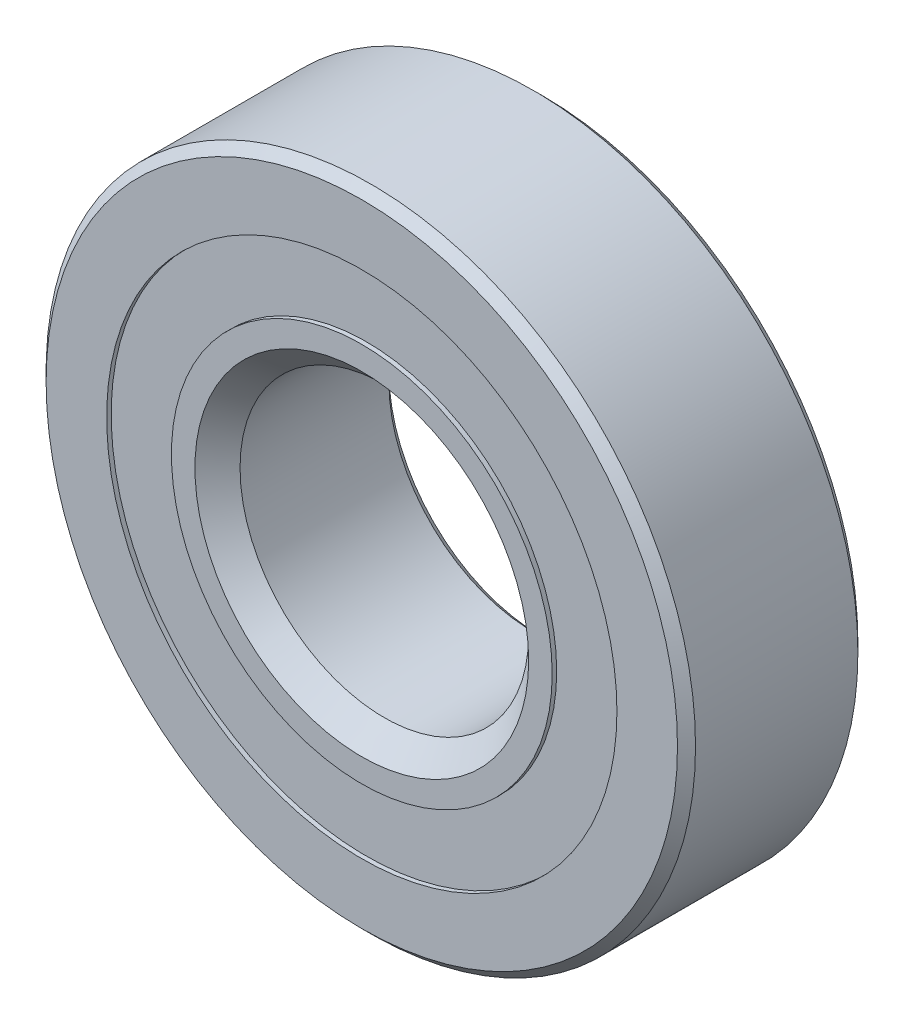
ISO-10303-21;
HEADER;
FILE_DESCRIPTION(('STEP AP214'),'2;1');
FILE_NAME('part.step','',(''),(''),'','','');
FILE_SCHEMA(('AUTOMOTIVE_DESIGN { 1 0 10303 214 1 1 1 1 }'));
ENDSEC;
DATA;
#1=APPLICATION_CONTEXT('core data for automotive mechanical design processes');
#2=APPLICATION_PROTOCOL_DEFINITION('international standard','automotive_design',2000,#1);
#3=PRODUCT_CONTEXT('',#1,'mechanical');
#4=PRODUCT('Part','Part','',(#3));
#5=PRODUCT_RELATED_PRODUCT_CATEGORY('part','',(#4));
#6=PRODUCT_DEFINITION_FORMATION('','',#4);
#7=PRODUCT_DEFINITION_CONTEXT('part definition',#1,'design');
#8=PRODUCT_DEFINITION('design','',#6,#7);
#9=PRODUCT_DEFINITION_SHAPE('','',#8);
#10=(LENGTH_UNIT() NAMED_UNIT(*) SI_UNIT(.MILLI.,.METRE.));
#11=(NAMED_UNIT(*) PLANE_ANGLE_UNIT() SI_UNIT($,.RADIAN.));
#12=(NAMED_UNIT(*) SI_UNIT($,.STERADIAN.) SOLID_ANGLE_UNIT());
#13=UNCERTAINTY_MEASURE_WITH_UNIT(LENGTH_MEASURE(1.E-05),#10,'distance_accuracy_value','');
#14=(GEOMETRIC_REPRESENTATION_CONTEXT(3) GLOBAL_UNCERTAINTY_ASSIGNED_CONTEXT((#13)) GLOBAL_UNIT_ASSIGNED_CONTEXT((#10,
#11,#12)) REPRESENTATION_CONTEXT('',''));
#15=CARTESIAN_POINT('',(0.,0.,0.));
#16=DIRECTION('',(0.,0.,1.));
#17=DIRECTION('',(1.,0.,0.));
#18=AXIS2_PLACEMENT_3D('',#15,#16,#17);
#19=CARTESIAN_POINT('',(0.,11.2258928571429,-3.77031250000001));
#20=DIRECTION('',(0.,0.,1.));
#21=DIRECTION('',(1.,0.,0.));
#22=AXIS2_PLACEMENT_3D('',#19,#20,#21);
#23=PLANE('',#22);
#24=CARTESIAN_POINT('',(0.,0.,-3.77031250000001));
#25=DIRECTION('',(0.,0.,1.));
#26=DIRECTION('',(1.,0.,0.));
#27=AXIS2_PLACEMENT_3D('',#24,#25,#26);
#28=CIRCLE('',#27,11.2258928571429);
#29=CARTESIAN_POINT('',(11.2258928571429,0.,-3.77031250000001));
#30=VERTEX_POINT('',#29);
#31=EDGE_CURVE('E57',#30,#30,#28,.T.);
#32=ORIENTED_EDGE('',*,*,#31,.F.);
#33=EDGE_LOOP('',(#32));
#34=FACE_BOUND('',#33,.T.);
#35=CARTESIAN_POINT('',(0.,0.,-3.77031250000001));
#36=DIRECTION('',(0.,0.,1.));
#37=DIRECTION('',(1.,0.,0.));
#38=AXIS2_PLACEMENT_3D('',#35,#36,#37);
#39=CIRCLE('',#38,8.37711985732587);
#40=CARTESIAN_POINT('',(8.37711985732587,0.,-3.77031250000001));
#41=VERTEX_POINT('',#40);
#42=EDGE_CURVE('E11',#41,#41,#39,.T.);
#43=ORIENTED_EDGE('',*,*,#42,.T.);
#44=EDGE_LOOP('',(#43));
#45=FACE_BOUND('',#44,.T.);
#46=ADVANCED_FACE('F43',(#34,#45),#23,.F.);
#47=CARTESIAN_POINT('',(0.,0.,3.96875));
#48=DIRECTION('',(0.,0.,1.));
#49=DIRECTION('',(1.,0.,0.));
#50=AXIS2_PLACEMENT_3D('',#47,#48,#49);
#51=CYLINDRICAL_SURFACE('',#50,8.37711985732587);
#52=ORIENTED_EDGE('',*,*,#42,.F.);
#53=EDGE_LOOP('',(#52));
#54=FACE_BOUND('',#53,.T.);
#55=CARTESIAN_POINT('',(0.,0.,-1.98348485641081));
#56=DIRECTION('',(0.,0.,1.));
#57=DIRECTION('',(1.,0.,0.));
#58=AXIS2_PLACEMENT_3D('',#55,#56,#57);
#59=CIRCLE('',#58,8.37711985732587);
#60=CARTESIAN_POINT('',(8.37711985732587,0.,-1.98348485641081));
#61=VERTEX_POINT('',#60);
#62=EDGE_CURVE('E49',#61,#61,#59,.T.);
#63=ORIENTED_EDGE('',*,*,#62,.T.);
#64=EDGE_LOOP('',(#63));
#65=FACE_BOUND('',#64,.T.);
#66=ADVANCED_FACE('F66',(#54,#65),#51,.F.);
#67=CARTESIAN_POINT('',(0.,11.2258928571429,-1.98348485641081));
#68=DIRECTION('',(0.,0.,-1.));
#69=DIRECTION('',(-1.,0.,0.));
#70=AXIS2_PLACEMENT_3D('',#67,#68,#69);
#71=PLANE('',#70);
#72=ORIENTED_EDGE('',*,*,#62,.F.);
#73=EDGE_LOOP('',(#72));
#74=FACE_BOUND('',#73,.T.);
#75=CARTESIAN_POINT('',(0.,0.,-1.98348485641081));
#76=DIRECTION('',(0.,0.,1.));
#77=DIRECTION('',(1.,0.,0.));
#78=AXIS2_PLACEMENT_3D('',#75,#76,#77);
#79=CIRCLE('',#78,11.2258928571429);
#80=CARTESIAN_POINT('',(11.2258928571429,0.,-1.98348485641081));
#81=VERTEX_POINT('',#80);
#82=EDGE_CURVE('E53',#81,#81,#79,.T.);
#83=ORIENTED_EDGE('',*,*,#82,.T.);
#84=EDGE_LOOP('',(#83));
#85=FACE_BOUND('',#84,.T.);
#86=ADVANCED_FACE('F70',(#74,#85),#71,.F.);
#87=CARTESIAN_POINT('',(0.,0.,3.96875));
#88=DIRECTION('',(0.,0.,1.));
#89=DIRECTION('',(1.,0.,0.));
#90=AXIS2_PLACEMENT_3D('',#87,#88,#89);
#91=CYLINDRICAL_SURFACE('',#90,11.2258928571429);
#92=ORIENTED_EDGE('',*,*,#82,.F.);
#93=EDGE_LOOP('',(#92));
#94=FACE_BOUND('',#93,.T.);
#95=ORIENTED_EDGE('',*,*,#31,.T.);
#96=EDGE_LOOP('',(#95));
#97=FACE_BOUND('',#96,.T.);
#98=ADVANCED_FACE('F63',(#94,#97),#91,.T.);
#99=CLOSED_SHELL('',(#46,#66,#86,#98));
#100=MANIFOLD_SOLID_BREP('B2',#99);
#101=CARTESIAN_POINT('',(0.,11.2258928571429,3.7703125));
#102=DIRECTION('',(0.,0.,-1.));
#103=DIRECTION('',(-1.,0.,0.));
#104=AXIS2_PLACEMENT_3D('',#101,#102,#103);
#105=PLANE('',#104);
#106=CARTESIAN_POINT('',(0.,0.,3.7703125));
#107=DIRECTION('',(0.,0.,1.));
#108=DIRECTION('',(1.,0.,0.));
#109=AXIS2_PLACEMENT_3D('',#106,#107,#108);
#110=CIRCLE('',#109,8.37711985732587);
#111=CARTESIAN_POINT('',(8.37711985732587,0.,3.7703125));
#112=VERTEX_POINT('',#111);
#113=EDGE_CURVE('E42',#112,#112,#110,.T.);
#114=ORIENTED_EDGE('',*,*,#113,.F.);
#115=EDGE_LOOP('',(#114));
#116=FACE_BOUND('',#115,.T.);
#117=CARTESIAN_POINT('',(0.,0.,3.7703125));
#118=DIRECTION('',(0.,0.,1.));
#119=DIRECTION('',(1.,0.,0.));
#120=AXIS2_PLACEMENT_3D('',#117,#118,#119);
#121=CIRCLE('',#120,11.2258928571429);
#122=CARTESIAN_POINT('',(11.2258928571429,0.,3.7703125));
#123=VERTEX_POINT('',#122);
#124=EDGE_CURVE('E124',#123,#123,#121,.T.);
#125=ORIENTED_EDGE('',*,*,#124,.T.);
#126=EDGE_LOOP('',(#125));
#127=FACE_BOUND('',#126,.T.);
#128=ADVANCED_FACE('F110',(#116,#127),#105,.F.);
#129=CARTESIAN_POINT('',(0.,0.,3.96875));
#130=DIRECTION('',(0.,0.,1.));
#131=DIRECTION('',(1.,0.,0.));
#132=AXIS2_PLACEMENT_3D('',#129,#130,#131);
#133=CYLINDRICAL_SURFACE('',#132,8.37711985732587);
#134=CARTESIAN_POINT('',(0.,0.,1.9834848564108));
#135=DIRECTION('',(0.,0.,1.));
#136=DIRECTION('',(1.,0.,0.));
#137=AXIS2_PLACEMENT_3D('',#134,#135,#136);
#138=CIRCLE('',#137,8.37711985732587);
#139=CARTESIAN_POINT('',(8.37711985732587,0.,1.9834848564108));
#140=VERTEX_POINT('',#139);
#141=EDGE_CURVE('E116',#140,#140,#138,.T.);
#142=ORIENTED_EDGE('',*,*,#141,.F.);
#143=EDGE_LOOP('',(#142));
#144=FACE_BOUND('',#143,.T.);
#145=ORIENTED_EDGE('',*,*,#113,.T.);
#146=EDGE_LOOP('',(#145));
#147=FACE_BOUND('',#146,.T.);
#148=ADVANCED_FACE('F139',(#144,#147),#133,.F.);
#149=CARTESIAN_POINT('',(0.,11.2258928571429,1.9834848564108));
#150=DIRECTION('',(0.,0.,1.));
#151=DIRECTION('',(1.,0.,0.));
#152=AXIS2_PLACEMENT_3D('',#149,#150,#151);
#153=PLANE('',#152);
#154=CARTESIAN_POINT('',(0.,0.,1.9834848564108));
#155=DIRECTION('',(0.,0.,1.));
#156=DIRECTION('',(1.,0.,0.));
#157=AXIS2_PLACEMENT_3D('',#154,#155,#156);
#158=CIRCLE('',#157,11.2258928571429);
#159=CARTESIAN_POINT('',(11.2258928571429,0.,1.9834848564108));
#160=VERTEX_POINT('',#159);
#161=EDGE_CURVE('E120',#160,#160,#158,.T.);
#162=ORIENTED_EDGE('',*,*,#161,.F.);
#163=EDGE_LOOP('',(#162));
#164=FACE_BOUND('',#163,.T.);
#165=ORIENTED_EDGE('',*,*,#141,.T.);
#166=EDGE_LOOP('',(#165));
#167=FACE_BOUND('',#166,.T.);
#168=ADVANCED_FACE('F134',(#164,#167),#153,.F.);
#169=CARTESIAN_POINT('',(0.,0.,3.96875));
#170=DIRECTION('',(0.,0.,1.));
#171=DIRECTION('',(1.,0.,0.));
#172=AXIS2_PLACEMENT_3D('',#169,#170,#171);
#173=CYLINDRICAL_SURFACE('',#172,11.2258928571429);
#174=ORIENTED_EDGE('',*,*,#124,.F.);
#175=EDGE_LOOP('',(#174));
#176=FACE_BOUND('',#175,.T.);
#177=ORIENTED_EDGE('',*,*,#161,.T.);
#178=EDGE_LOOP('',(#177));
#179=FACE_BOUND('',#178,.T.);
#180=ADVANCED_FACE('F131',(#176,#179),#173,.T.);
#181=CLOSED_SHELL('',(#128,#148,#168,#180));
#182=MANIFOLD_SOLID_BREP('B6',#181);
#183=CARTESIAN_POINT('',(-5.15937499999989,8.93629963530074,0.));
#184=DIRECTION('',(0.,0.,1.));
#185=DIRECTION('',(-0.499999999999989,0.866025403784445,0.));
#186=AXIS2_PLACEMENT_3D('',#183,#184,#185);
#187=SPHERICAL_SURFACE('',#186,1.9834848564108);
#188=CARTESIAN_POINT('',(-5.15937499999989,8.93629963530074,1.9834848564108));
#189=VERTEX_POINT('',#188);
#190=VERTEX_LOOP('',#189);
#191=FACE_BOUND('',#190,.T.);
#192=ADVANCED_FACE('F192',(#191),#187,.T.);
#193=CLOSED_SHELL('',(#192));
#194=MANIFOLD_SOLID_BREP('B37',#193);
#195=CARTESIAN_POINT('',(-8.93629963530062,5.1593750000001,0.));
#196=DIRECTION('',(0.,0.,1.));
#197=DIRECTION('',(-0.866025403784433,0.50000000000001,0.));
#198=AXIS2_PLACEMENT_3D('',#195,#196,#197);
#199=SPHERICAL_SURFACE('',#198,1.9834848564108);
#200=CARTESIAN_POINT('',(-8.93629963530062,5.1593750000001,1.9834848564108));
#201=VERTEX_POINT('',#200);
#202=VERTEX_LOOP('',#201);
#203=FACE_BOUND('',#202,.T.);
#204=ADVANCED_FACE('F225',(#203),#199,.T.);
#205=CLOSED_SHELL('',(#204));
#206=MANIFOLD_SOLID_BREP('B106',#205);
#207=CARTESIAN_POINT('',(-10.31875,1.08083169195563E-13,0.));
#208=DIRECTION('',(0.,0.,1.));
#209=DIRECTION('',(-1.,0.,0.));
#210=AXIS2_PLACEMENT_3D('',#207,#208,#209);
#211=SPHERICAL_SURFACE('',#210,1.9834848564108);
#212=CARTESIAN_POINT('',(-10.31875,1.08083169195563E-13,1.9834848564108));
#213=VERTEX_POINT('',#212);
#214=VERTEX_LOOP('',#213);
#215=FACE_BOUND('',#214,.T.);
#216=ADVANCED_FACE('F258',(#215),#211,.T.);
#217=CLOSED_SHELL('',(#216));
#218=MANIFOLD_SOLID_BREP('B188',#217);
#219=CARTESIAN_POINT('',(-8.93629963530072,-5.15937499999992,0.));
#220=DIRECTION('',(0.,0.,1.));
#221=DIRECTION('',(-0.866025403784443,-0.499999999999992,0.));
#222=AXIS2_PLACEMENT_3D('',#219,#220,#221);
#223=SPHERICAL_SURFACE('',#222,1.9834848564108);
#224=CARTESIAN_POINT('',(-8.93629963530072,-5.15937499999992,1.9834848564108));
#225=VERTEX_POINT('',#224);
#226=VERTEX_LOOP('',#225);
#227=FACE_BOUND('',#226,.T.);
#228=ADVANCED_FACE('F291',(#227),#223,.T.);
#229=CLOSED_SHELL('',(#228));
#230=MANIFOLD_SOLID_BREP('B221',#229);
#231=CARTESIAN_POINT('',(-5.15937500000007,-8.93629963530064,0.));
#232=DIRECTION('',(0.,0.,1.));
#233=DIRECTION('',(-0.500000000000007,-0.866025403784435,0.));
#234=AXIS2_PLACEMENT_3D('',#231,#232,#233);
#235=SPHERICAL_SURFACE('',#234,1.9834848564108);
#236=CARTESIAN_POINT('',(-5.15937500000007,-8.93629963530064,1.9834848564108));
#237=VERTEX_POINT('',#236);
#238=VERTEX_LOOP('',#237);
#239=FACE_BOUND('',#238,.T.);
#240=ADVANCED_FACE('F324',(#239),#235,.T.);
#241=CLOSED_SHELL('',(#240));
#242=MANIFOLD_SOLID_BREP('B254',#241);
#243=CARTESIAN_POINT('',(0.,-10.31875,0.));
#244=DIRECTION('',(0.,0.,1.));
#245=DIRECTION('',(0.,-1.,0.));
#246=AXIS2_PLACEMENT_3D('',#243,#244,#245);
#247=SPHERICAL_SURFACE('',#246,1.9834848564108);
#248=CARTESIAN_POINT('',(0.,-10.31875,1.9834848564108));
#249=VERTEX_POINT('',#248);
#250=VERTEX_LOOP('',#249);
#251=FACE_BOUND('',#250,.T.);
#252=ADVANCED_FACE('F357',(#251),#247,.T.);
#253=CLOSED_SHELL('',(#252));
#254=MANIFOLD_SOLID_BREP('B287',#253);
#255=CARTESIAN_POINT('',(5.15937499999995,-8.93629963530071,0.));
#256=DIRECTION('',(0.,0.,1.));
#257=DIRECTION('',(0.499999999999995,-0.866025403784442,0.));
#258=AXIS2_PLACEMENT_3D('',#255,#256,#257);
#259=SPHERICAL_SURFACE('',#258,1.9834848564108);
#260=CARTESIAN_POINT('',(5.15937499999995,-8.93629963530071,1.9834848564108));
#261=VERTEX_POINT('',#260);
#262=VERTEX_LOOP('',#261);
#263=FACE_BOUND('',#262,.T.);
#264=ADVANCED_FACE('F390',(#263),#259,.T.);
#265=CLOSED_SHELL('',(#264));
#266=MANIFOLD_SOLID_BREP('B320',#265);
#267=CARTESIAN_POINT('',(8.93629963530065,-5.15937500000004,0.));
#268=DIRECTION('',(0.,0.,1.));
#269=DIRECTION('',(0.866025403784436,-0.500000000000004,0.));
#270=AXIS2_PLACEMENT_3D('',#267,#268,#269);
#271=SPHERICAL_SURFACE('',#270,1.9834848564108);
#272=CARTESIAN_POINT('',(8.93629963530065,-5.15937500000004,1.9834848564108));
#273=VERTEX_POINT('',#272);
#274=VERTEX_LOOP('',#273);
#275=FACE_BOUND('',#274,.T.);
#276=ADVANCED_FACE('F421',(#275),#271,.T.);
#277=CLOSED_SHELL('',(#276));
#278=MANIFOLD_SOLID_BREP('B353',#277);
#279=CARTESIAN_POINT('',(10.31875,0.,0.));
#280=DIRECTION('',(0.,0.,1.));
#281=DIRECTION('',(1.,0.,0.));
#282=AXIS2_PLACEMENT_3D('',#279,#280,#281);
#283=SPHERICAL_SURFACE('',#282,1.9834848564108);
#284=CARTESIAN_POINT('',(10.31875,0.,1.9834848564108));
#285=VERTEX_POINT('',#284);
#286=VERTEX_LOOP('',#285);
#287=FACE_BOUND('',#286,.T.);
#288=ADVANCED_FACE('F454',(#287),#283,.T.);
#289=CLOSED_SHELL('',(#288));
#290=MANIFOLD_SOLID_BREP('B386',#289);
#291=CARTESIAN_POINT('',(8.93629963530069,5.15937499999998,0.));
#292=DIRECTION('',(0.,0.,1.));
#293=DIRECTION('',(0.86602540378444,0.499999999999998,0.));
#294=AXIS2_PLACEMENT_3D('',#291,#292,#293);
#295=SPHERICAL_SURFACE('',#294,1.9834848564108);
#296=CARTESIAN_POINT('',(8.93629963530069,5.15937499999998,1.9834848564108));
#297=VERTEX_POINT('',#296);
#298=VERTEX_LOOP('',#297);
#299=FACE_BOUND('',#298,.T.);
#300=ADVANCED_FACE('F487',(#299),#295,.T.);
#301=CLOSED_SHELL('',(#300));
#302=MANIFOLD_SOLID_BREP('B417',#301);
#303=CARTESIAN_POINT('',(5.15937500000001,8.93629963530067,0.));
#304=DIRECTION('',(0.,0.,1.));
#305=DIRECTION('',(0.500000000000001,0.866025403784438,0.));
#306=AXIS2_PLACEMENT_3D('',#303,#304,#305);
#307=SPHERICAL_SURFACE('',#306,1.9834848564108);
#308=CARTESIAN_POINT('',(5.15937500000001,8.93629963530067,1.9834848564108));
#309=VERTEX_POINT('',#308);
#310=VERTEX_LOOP('',#309);
#311=FACE_BOUND('',#310,.T.);
#312=ADVANCED_FACE('F520',(#311),#307,.T.);
#313=CLOSED_SHELL('',(#312));
#314=MANIFOLD_SOLID_BREP('B450',#313);
#315=CARTESIAN_POINT('',(0.,10.31875,0.));
#316=DIRECTION('',(0.,0.,1.));
#317=DIRECTION('',(0.,1.,0.));
#318=AXIS2_PLACEMENT_3D('',#315,#316,#317);
#319=SPHERICAL_SURFACE('',#318,1.9834848564108);
#320=CARTESIAN_POINT('',(0.,10.31875,1.9834848564108));
#321=VERTEX_POINT('',#320);
#322=VERTEX_LOOP('',#321);
#323=FACE_BOUND('',#322,.T.);
#324=ADVANCED_FACE('F553',(#323),#319,.T.);
#325=CLOSED_SHELL('',(#324));
#326=MANIFOLD_SOLID_BREP('B483',#325);
#327=CARTESIAN_POINT('',(0.,0.,3.96875));
#328=DIRECTION('',(0.,0.,1.));
#329=DIRECTION('',(1.,0.,0.));
#330=AXIS2_PLACEMENT_3D('',#327,#328,#329);
#331=CYLINDRICAL_SURFACE('',#330,8.37711985732587);
#332=CARTESIAN_POINT('',(0.,0.,3.96875));
#333=DIRECTION('',(0.,0.,1.));
#334=DIRECTION('',(1.,0.,0.));
#335=AXIS2_PLACEMENT_3D('',#332,#333,#334);
#336=CIRCLE('',#335,8.37711985732587);
#337=CARTESIAN_POINT('',(8.37711985732587,0.,3.96875));
#338=VERTEX_POINT('',#337);
#339=EDGE_CURVE('E612',#338,#338,#336,.T.);
#340=ORIENTED_EDGE('',*,*,#339,.F.);
#341=EDGE_LOOP('',(#340));
#342=FACE_BOUND('',#341,.T.);
#343=CARTESIAN_POINT('',(0.,0.,3.7703125));
#344=DIRECTION('',(0.,0.,1.));
#345=DIRECTION('',(1.,0.,0.));
#346=AXIS2_PLACEMENT_3D('',#343,#344,#345);
#347=CIRCLE('',#346,8.37711985732587);
#348=CARTESIAN_POINT('',(8.37711985732587,0.,3.7703125));
#349=VERTEX_POINT('',#348);
#350=EDGE_CURVE('E552',#349,#349,#347,.T.);
#351=ORIENTED_EDGE('',*,*,#350,.T.);
#352=EDGE_LOOP('',(#351));
#353=FACE_BOUND('',#352,.T.);
#354=ADVANCED_FACE('F572',(#342,#353),#331,.T.);
#355=CARTESIAN_POINT('',(0.,8.37711985732587,3.7703125));
#356=DIRECTION('',(0.,0.,1.));
#357=DIRECTION('',(1.,0.,0.));
#358=AXIS2_PLACEMENT_3D('',#355,#356,#357);
#359=PLANE('',#358);
#360=ORIENTED_EDGE('',*,*,#350,.F.);
#361=EDGE_LOOP('',(#360));
#362=FACE_BOUND('',#361,.T.);
#363=CARTESIAN_POINT('',(0.,0.,3.7703125));
#364=DIRECTION('',(0.,0.,1.));
#365=DIRECTION('',(1.,0.,0.));
#366=AXIS2_PLACEMENT_3D('',#363,#364,#365);
#367=CIRCLE('',#366,8.17868235732587);
#368=CARTESIAN_POINT('',(8.17868235732587,0.,3.7703125));
#369=VERTEX_POINT('',#368);
#370=EDGE_CURVE('E578',#369,#369,#367,.T.);
#371=ORIENTED_EDGE('',*,*,#370,.T.);
#372=EDGE_LOOP('',(#371));
#373=FACE_BOUND('',#372,.T.);
#374=ADVANCED_FACE('F619',(#362,#373),#359,.F.);
#375=CARTESIAN_POINT('',(0.,0.,2.93426271446873));
#376=DIRECTION('',(0.,0.,1.));
#377=DIRECTION('',(1.,0.,0.));
#378=AXIS2_PLACEMENT_3D('',#375,#376,#377);
#379=CONICAL_SURFACE('',#378,7.3426325717946,0.78539816339745);
#380=ORIENTED_EDGE('',*,*,#370,.F.);
#381=EDGE_LOOP('',(#380));
#382=FACE_BOUND('',#381,.T.);
#383=CARTESIAN_POINT('',(0.,0.,2.93426271446873));
#384=DIRECTION('',(0.,0.,1.));
#385=DIRECTION('',(1.,0.,0.));
#386=AXIS2_PLACEMENT_3D('',#383,#384,#385);
#387=CIRCLE('',#386,7.3426325717946);
#388=CARTESIAN_POINT('',(7.3426325717946,0.,2.93426271446873));
#389=VERTEX_POINT('',#388);
#390=EDGE_CURVE('E582',#389,#389,#387,.T.);
#391=ORIENTED_EDGE('',*,*,#390,.T.);
#392=EDGE_LOOP('',(#391));
#393=FACE_BOUND('',#392,.T.);
#394=ADVANCED_FACE('F623',(#382,#393),#379,.T.);
#395=CARTESIAN_POINT('',(0.,0.,3.96875));
#396=DIRECTION('',(0.,0.,1.));
#397=DIRECTION('',(1.,0.,0.));
#398=AXIS2_PLACEMENT_3D('',#395,#396,#397);
#399=CYLINDRICAL_SURFACE('',#398,7.3426325717946);
#400=ORIENTED_EDGE('',*,*,#390,.F.);
#401=EDGE_LOOP('',(#400));
#402=FACE_BOUND('',#401,.T.);
#403=CARTESIAN_POINT('',(0.,0.,0.));
#404=DIRECTION('',(0.,0.,1.));
#405=DIRECTION('',(1.,0.,0.));
#406=AXIS2_PLACEMENT_3D('',#403,#404,#405);
#407=CIRCLE('',#406,7.3426325717946);
#408=CARTESIAN_POINT('',(7.3426325717946,0.,0.));
#409=VERTEX_POINT('',#408);
#410=EDGE_CURVE('E586',#409,#409,#407,.T.);
#411=ORIENTED_EDGE('',*,*,#410,.T.);
#412=EDGE_LOOP('',(#411));
#413=FACE_BOUND('',#412,.T.);
#414=ADVANCED_FACE('F628',(#402,#413),#399,.T.);
#415=CARTESIAN_POINT('',(0.,7.3426325717946,0.));
#416=DIRECTION('',(0.,0.,-1.));
#417=DIRECTION('',(-1.,0.,0.));
#418=AXIS2_PLACEMENT_3D('',#415,#416,#417);
#419=PLANE('',#418);
#420=ORIENTED_EDGE('',*,*,#410,.F.);
#421=EDGE_LOOP('',(#420));
#422=FACE_BOUND('',#421,.T.);
#423=CARTESIAN_POINT('',(0.,0.,0.));
#424=DIRECTION('',(0.,0.,1.));
#425=DIRECTION('',(1.,0.,0.));
#426=AXIS2_PLACEMENT_3D('',#423,#424,#425);
#427=CIRCLE('',#426,8.3352651435892);
#428=CARTESIAN_POINT('',(8.3352651435892,0.,0.));
#429=VERTEX_POINT('',#428);
#430=EDGE_CURVE('E591',#429,#429,#427,.T.);
#431=ORIENTED_EDGE('',*,*,#430,.T.);
#432=EDGE_LOOP('',(#431));
#433=FACE_BOUND('',#432,.T.);
#434=ADVANCED_FACE('F634',(#422,#433),#419,.F.);
#435=CARTESIAN_POINT('',(0.,0.,0.));
#436=DIRECTION('',(0.,0.,1.));
#437=DIRECTION('',(1.,0.,0.));
#438=AXIS2_PLACEMENT_3D('',#435,#436,#437);
#439=TOROIDAL_SURFACE('',#438,10.31875,1.9834848564108);
#440=ORIENTED_EDGE('',*,*,#430,.F.);
#441=EDGE_LOOP('',(#440));
#442=FACE_BOUND('',#441,.T.);
#443=CARTESIAN_POINT('',(0.,0.,-1.76388888888889));
#444=DIRECTION('',(0.,0.,1.));
#445=DIRECTION('',(1.,0.,0.));
#446=AXIS2_PLACEMENT_3D('',#443,#444,#445);
#447=CIRCLE('',#446,9.41160714285714);
#448=CARTESIAN_POINT('',(9.41160714285714,0.,-1.76388888888889));
#449=VERTEX_POINT('',#448);
#450=EDGE_CURVE('E594',#449,#449,#447,.T.);
#451=ORIENTED_EDGE('',*,*,#450,.T.);
#452=EDGE_LOOP('',(#451));
#453=FACE_BOUND('',#452,.T.);
#454=ADVANCED_FACE('F638',(#442,#453),#439,.F.);
#455=CARTESIAN_POINT('',(0.,0.,3.96875));
#456=DIRECTION('',(0.,0.,1.));
#457=DIRECTION('',(1.,0.,0.));
#458=AXIS2_PLACEMENT_3D('',#455,#456,#457);
#459=CYLINDRICAL_SURFACE('',#458,9.41160714285715);
#460=ORIENTED_EDGE('',*,*,#450,.F.);
#461=EDGE_LOOP('',(#460));
#462=FACE_BOUND('',#461,.T.);
#463=CARTESIAN_POINT('',(0.,0.,-3.96875000000001));
#464=DIRECTION('',(0.,0.,1.));
#465=DIRECTION('',(1.,0.,0.));
#466=AXIS2_PLACEMENT_3D('',#463,#464,#465);
#467=CIRCLE('',#466,9.41160714285715);
#468=CARTESIAN_POINT('',(9.41160714285715,0.,-3.96875000000001));
#469=VERTEX_POINT('',#468);
#470=EDGE_CURVE('E597',#469,#469,#467,.T.);
#471=ORIENTED_EDGE('',*,*,#470,.T.);
#472=EDGE_LOOP('',(#471));
#473=FACE_BOUND('',#472,.T.);
#474=ADVANCED_FACE('F642',(#462,#473),#459,.T.);
#475=CARTESIAN_POINT('',(0.,6.746875,-3.96875000000001));
#476=DIRECTION('',(0.,0.,1.));
#477=DIRECTION('',(1.,0.,0.));
#478=AXIS2_PLACEMENT_3D('',#475,#476,#477);
#479=PLANE('',#478);
#480=ORIENTED_EDGE('',*,*,#470,.F.);
#481=EDGE_LOOP('',(#480));
#482=FACE_BOUND('',#481,.T.);
#483=CARTESIAN_POINT('',(0.,0.,-3.96875000000001));
#484=DIRECTION('',(0.,0.,1.));
#485=DIRECTION('',(1.,0.,0.));
#486=AXIS2_PLACEMENT_3D('',#483,#484,#485);
#487=CIRCLE('',#486,6.746875);
#488=CARTESIAN_POINT('',(6.746875,0.,-3.96875000000001));
#489=VERTEX_POINT('',#488);
#490=EDGE_CURVE('E600',#489,#489,#487,.T.);
#491=ORIENTED_EDGE('',*,*,#490,.T.);
#492=EDGE_LOOP('',(#491));
#493=FACE_BOUND('',#492,.T.);
#494=ADVANCED_FACE('F646',(#482,#493),#479,.F.);
#495=CARTESIAN_POINT('',(0.,0.,-3.57187500000001));
#496=DIRECTION('',(0.,0.,-1.));
#497=DIRECTION('',(-1.,0.,0.));
#498=AXIS2_PLACEMENT_3D('',#495,#496,#497);
#499=CONICAL_SURFACE('',#498,6.35,0.785398163397446);
#500=ORIENTED_EDGE('',*,*,#490,.F.);
#501=EDGE_LOOP('',(#500));
#502=FACE_BOUND('',#501,.T.);
#503=CARTESIAN_POINT('',(0.,0.,-3.57187500000001));
#504=DIRECTION('',(0.,0.,1.));
#505=DIRECTION('',(1.,0.,0.));
#506=AXIS2_PLACEMENT_3D('',#503,#504,#505);
#507=CIRCLE('',#506,6.35);
#508=CARTESIAN_POINT('',(6.35,0.,-3.57187500000001));
#509=VERTEX_POINT('',#508);
#510=EDGE_CURVE('E603',#509,#509,#507,.T.);
#511=ORIENTED_EDGE('',*,*,#510,.T.);
#512=EDGE_LOOP('',(#511));
#513=FACE_BOUND('',#512,.T.);
#514=ADVANCED_FACE('F650',(#502,#513),#499,.F.);
#515=CARTESIAN_POINT('',(0.,0.,3.96875));
#516=DIRECTION('',(0.,0.,1.));
#517=DIRECTION('',(1.,0.,0.));
#518=AXIS2_PLACEMENT_3D('',#515,#516,#517);
#519=CYLINDRICAL_SURFACE('',#518,6.35);
#520=ORIENTED_EDGE('',*,*,#510,.F.);
#521=EDGE_LOOP('',(#520));
#522=FACE_BOUND('',#521,.T.);
#523=CARTESIAN_POINT('',(0.,0.,2.9761174282054));
#524=DIRECTION('',(0.,0.,1.));
#525=DIRECTION('',(1.,0.,0.));
#526=AXIS2_PLACEMENT_3D('',#523,#524,#525);
#527=CIRCLE('',#526,6.35);
#528=CARTESIAN_POINT('',(6.35,0.,2.9761174282054));
#529=VERTEX_POINT('',#528);
#530=EDGE_CURVE('E606',#529,#529,#527,.T.);
#531=ORIENTED_EDGE('',*,*,#530,.T.);
#532=EDGE_LOOP('',(#531));
#533=FACE_BOUND('',#532,.T.);
#534=ADVANCED_FACE('F654',(#522,#533),#519,.F.);
#535=CARTESIAN_POINT('',(0.,0.,3.96875));
#536=DIRECTION('',(0.,0.,1.));
#537=DIRECTION('',(1.,0.,0.));
#538=AXIS2_PLACEMENT_3D('',#535,#536,#537);
#539=CONICAL_SURFACE('',#538,7.3426325717946,0.785398163397449);
#540=ORIENTED_EDGE('',*,*,#530,.F.);
#541=EDGE_LOOP('',(#540));
#542=FACE_BOUND('',#541,.T.);
#543=CARTESIAN_POINT('',(0.,0.,3.96875));
#544=DIRECTION('',(0.,0.,1.));
#545=DIRECTION('',(1.,0.,0.));
#546=AXIS2_PLACEMENT_3D('',#543,#544,#545);
#547=CIRCLE('',#546,7.3426325717946);
#548=CARTESIAN_POINT('',(7.3426325717946,0.,3.96875));
#549=VERTEX_POINT('',#548);
#550=EDGE_CURVE('E609',#549,#549,#547,.T.);
#551=ORIENTED_EDGE('',*,*,#550,.T.);
#552=EDGE_LOOP('',(#551));
#553=FACE_BOUND('',#552,.T.);
#554=ADVANCED_FACE('F658',(#542,#553),#539,.F.);
#555=CARTESIAN_POINT('',(0.,8.37711985732587,3.96875));
#556=DIRECTION('',(0.,0.,-1.));
#557=DIRECTION('',(-1.,0.,0.));
#558=AXIS2_PLACEMENT_3D('',#555,#556,#557);
#559=PLANE('',#558);
#560=ORIENTED_EDGE('',*,*,#550,.F.);
#561=EDGE_LOOP('',(#560));
#562=FACE_BOUND('',#561,.T.);
#563=ORIENTED_EDGE('',*,*,#339,.T.);
#564=EDGE_LOOP('',(#563));
#565=FACE_BOUND('',#564,.T.);
#566=ADVANCED_FACE('F616',(#562,#565),#559,.F.);
#567=CLOSED_SHELL('',(#354,#374,#394,#414,#434,#454,#474,#494,#514,#534,#554,#566));
#568=MANIFOLD_SOLID_BREP('B516',#567);
#569=CARTESIAN_POINT('',(0.,0.,3.571875));
#570=DIRECTION('',(0.,0.,-1.));
#571=DIRECTION('',(-1.,0.,0.));
#572=AXIS2_PLACEMENT_3D('',#569,#570,#571);
#573=CONICAL_SURFACE('',#572,14.2875,0.785398163397446);
#574=CARTESIAN_POINT('',(0.,0.,3.96875));
#575=DIRECTION('',(0.,0.,1.));
#576=DIRECTION('',(1.,0.,0.));
#577=AXIS2_PLACEMENT_3D('',#574,#575,#576);
#578=CIRCLE('',#577,13.890625);
#579=CARTESIAN_POINT('',(13.890625,0.,3.96875));
#580=VERTEX_POINT('',#579);
#581=EDGE_CURVE('E781',#580,#580,#578,.T.);
#582=ORIENTED_EDGE('',*,*,#581,.F.);
#583=EDGE_LOOP('',(#582));
#584=FACE_BOUND('',#583,.T.);
#585=CARTESIAN_POINT('',(0.,0.,3.571875));
#586=DIRECTION('',(0.,0.,1.));
#587=DIRECTION('',(1.,0.,0.));
#588=AXIS2_PLACEMENT_3D('',#585,#586,#587);
#589=CIRCLE('',#588,14.2875);
#590=CARTESIAN_POINT('',(14.2875,0.,3.571875));
#591=VERTEX_POINT('',#590);
#592=EDGE_CURVE('E571',#591,#591,#589,.T.);
#593=ORIENTED_EDGE('',*,*,#592,.T.);
#594=EDGE_LOOP('',(#593));
#595=FACE_BOUND('',#594,.T.);
#596=ADVANCED_FACE('F753',(#584,#595),#573,.T.);
#597=CARTESIAN_POINT('',(0.,0.,3.96875));
#598=DIRECTION('',(0.,0.,1.));
#599=DIRECTION('',(1.,0.,0.));
#600=AXIS2_PLACEMENT_3D('',#597,#598,#599);
#601=CYLINDRICAL_SURFACE('',#600,14.2875);
#602=ORIENTED_EDGE('',*,*,#592,.F.);
#603=EDGE_LOOP('',(#602));
#604=FACE_BOUND('',#603,.T.);
#605=CARTESIAN_POINT('',(0.,0.,-3.57187500000001));
#606=DIRECTION('',(0.,0.,1.));
#607=DIRECTION('',(1.,0.,0.));
#608=AXIS2_PLACEMENT_3D('',#605,#606,#607);
#609=CIRCLE('',#608,14.2875);
#610=CARTESIAN_POINT('',(14.2875,0.,-3.57187500000001));
#611=VERTEX_POINT('',#610);
#612=EDGE_CURVE('E759',#611,#611,#609,.T.);
#613=ORIENTED_EDGE('',*,*,#612,.T.);
#614=EDGE_LOOP('',(#613));
#615=FACE_BOUND('',#614,.T.);
#616=ADVANCED_FACE('F788',(#604,#615),#601,.T.);
#617=CARTESIAN_POINT('',(0.,0.,-3.96875000000001));
#618=DIRECTION('',(0.,0.,1.));
#619=DIRECTION('',(1.,0.,0.));
#620=AXIS2_PLACEMENT_3D('',#617,#618,#619);
#621=CONICAL_SURFACE('',#620,13.890625,0.785398163397446);
#622=ORIENTED_EDGE('',*,*,#612,.F.);
#623=EDGE_LOOP('',(#622));
#624=FACE_BOUND('',#623,.T.);
#625=CARTESIAN_POINT('',(0.,0.,-3.96875000000001));
#626=DIRECTION('',(0.,0.,1.));
#627=DIRECTION('',(1.,0.,0.));
#628=AXIS2_PLACEMENT_3D('',#625,#626,#627);
#629=CIRCLE('',#628,13.890625);
#630=CARTESIAN_POINT('',(13.890625,0.,-3.96875000000001));
#631=VERTEX_POINT('',#630);
#632=EDGE_CURVE('E763',#631,#631,#629,.T.);
#633=ORIENTED_EDGE('',*,*,#632,.T.);
#634=EDGE_LOOP('',(#633));
#635=FACE_BOUND('',#634,.T.);
#636=ADVANCED_FACE('F792',(#624,#635),#621,.T.);
#637=CARTESIAN_POINT('',(0.,13.890625,-3.96875000000001));
#638=DIRECTION('',(0.,0.,1.));
#639=DIRECTION('',(1.,0.,0.));
#640=AXIS2_PLACEMENT_3D('',#637,#638,#639);
#641=PLANE('',#640);
#642=ORIENTED_EDGE('',*,*,#632,.F.);
#643=EDGE_LOOP('',(#642));
#644=FACE_BOUND('',#643,.T.);
#645=CARTESIAN_POINT('',(0.,0.,-3.96875000000001));
#646=DIRECTION('',(0.,0.,1.));
#647=DIRECTION('',(1.,0.,0.));
#648=AXIS2_PLACEMENT_3D('',#645,#646,#647);
#649=CIRCLE('',#648,11.2258928571429);
#650=CARTESIAN_POINT('',(11.2258928571429,0.,-3.96875000000001));
#651=VERTEX_POINT('',#650);
#652=EDGE_CURVE('E767',#651,#651,#649,.T.);
#653=ORIENTED_EDGE('',*,*,#652,.T.);
#654=EDGE_LOOP('',(#653));
#655=FACE_BOUND('',#654,.T.);
#656=ADVANCED_FACE('F797',(#644,#655),#641,.F.);
#657=CARTESIAN_POINT('',(0.,0.,3.96875));
#658=DIRECTION('',(0.,0.,1.));
#659=DIRECTION('',(1.,0.,0.));
#660=AXIS2_PLACEMENT_3D('',#657,#658,#659);
#661=CYLINDRICAL_SURFACE('',#660,11.2258928571429);
#662=ORIENTED_EDGE('',*,*,#652,.F.);
#663=EDGE_LOOP('',(#662));
#664=FACE_BOUND('',#663,.T.);
#665=CARTESIAN_POINT('',(0.,0.,-1.76388888888889));
#666=DIRECTION('',(0.,0.,1.));
#667=DIRECTION('',(1.,0.,0.));
#668=AXIS2_PLACEMENT_3D('',#665,#666,#667);
#669=CIRCLE('',#668,11.2258928571429);
#670=CARTESIAN_POINT('',(11.2258928571429,0.,-1.76388888888889));
#671=VERTEX_POINT('',#670);
#672=EDGE_CURVE('E772',#671,#671,#669,.T.);
#673=ORIENTED_EDGE('',*,*,#672,.T.);
#674=EDGE_LOOP('',(#673));
#675=FACE_BOUND('',#674,.T.);
#676=ADVANCED_FACE('F803',(#664,#675),#661,.F.);
#677=CARTESIAN_POINT('',(0.,0.,0.));
#678=DIRECTION('',(0.,0.,1.));
#679=DIRECTION('',(1.,0.,0.));
#680=AXIS2_PLACEMENT_3D('',#677,#678,#679);
#681=TOROIDAL_SURFACE('',#680,10.31875,1.9834848564108);
#682=ORIENTED_EDGE('',*,*,#672,.F.);
#683=EDGE_LOOP('',(#682));
#684=FACE_BOUND('',#683,.T.);
#685=CARTESIAN_POINT('',(0.,0.,1.76388888888889));
#686=DIRECTION('',(0.,0.,1.));
#687=DIRECTION('',(1.,0.,0.));
#688=AXIS2_PLACEMENT_3D('',#685,#686,#687);
#689=CIRCLE('',#688,11.2258928571429);
#690=CARTESIAN_POINT('',(11.2258928571429,0.,1.76388888888889));
#691=VERTEX_POINT('',#690);
#692=EDGE_CURVE('E775',#691,#691,#689,.T.);
#693=ORIENTED_EDGE('',*,*,#692,.T.);
#694=EDGE_LOOP('',(#693));
#695=FACE_BOUND('',#694,.T.);
#696=ADVANCED_FACE('F807',(#684,#695),#681,.F.);
#697=CARTESIAN_POINT('',(0.,0.,3.96875));
#698=DIRECTION('',(0.,0.,1.));
#699=DIRECTION('',(1.,0.,0.));
#700=AXIS2_PLACEMENT_3D('',#697,#698,#699);
#701=CYLINDRICAL_SURFACE('',#700,11.2258928571429);
#702=ORIENTED_EDGE('',*,*,#692,.F.);
#703=EDGE_LOOP('',(#702));
#704=FACE_BOUND('',#703,.T.);
#705=CARTESIAN_POINT('',(0.,0.,3.96875));
#706=DIRECTION('',(0.,0.,1.));
#707=DIRECTION('',(1.,0.,0.));
#708=AXIS2_PLACEMENT_3D('',#705,#706,#707);
#709=CIRCLE('',#708,11.2258928571429);
#710=CARTESIAN_POINT('',(11.2258928571429,0.,3.96875));
#711=VERTEX_POINT('',#710);
#712=EDGE_CURVE('E778',#711,#711,#709,.T.);
#713=ORIENTED_EDGE('',*,*,#712,.T.);
#714=EDGE_LOOP('',(#713));
#715=FACE_BOUND('',#714,.T.);
#716=ADVANCED_FACE('F811',(#704,#715),#701,.F.);
#717=CARTESIAN_POINT('',(0.,13.890625,3.96875));
#718=DIRECTION('',(0.,0.,-1.));
#719=DIRECTION('',(-1.,0.,0.));
#720=AXIS2_PLACEMENT_3D('',#717,#718,#719);
#721=PLANE('',#720);
#722=ORIENTED_EDGE('',*,*,#712,.F.);
#723=EDGE_LOOP('',(#722));
#724=FACE_BOUND('',#723,.T.);
#725=ORIENTED_EDGE('',*,*,#581,.T.);
#726=EDGE_LOOP('',(#725));
#727=FACE_BOUND('',#726,.T.);
#728=ADVANCED_FACE('F785',(#724,#727),#721,.F.);
#729=CLOSED_SHELL('',(#596,#616,#636,#656,#676,#696,#716,#728));
#730=MANIFOLD_SOLID_BREP('B547',#729);
#731=ADVANCED_BREP_SHAPE_REPRESENTATION('',(#18,#100,#182,#194,#206,#218,#230,#242,#254,#266,
#278,#290,#302,#314,#326,#568,#730),#14);
#732=SHAPE_DEFINITION_REPRESENTATION(#9,#731);
ENDSEC;
END-ISO-10303-21;
